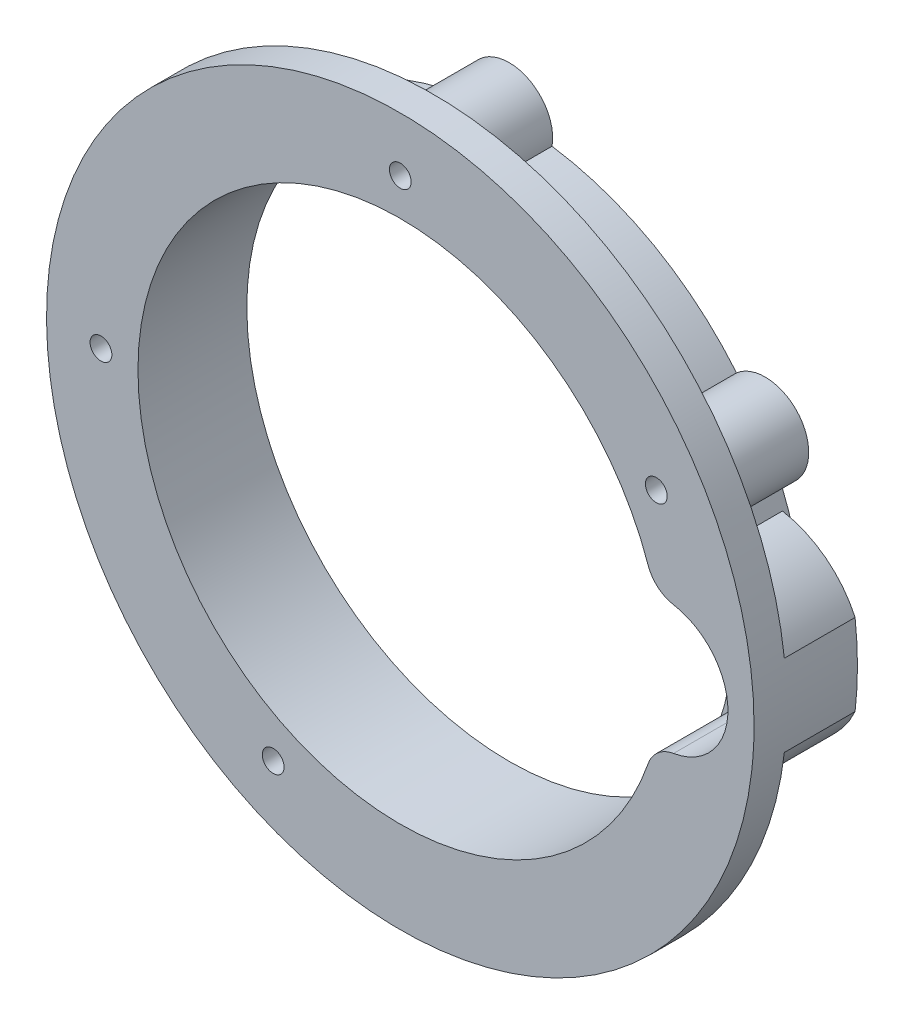
ISO-10303-21;
HEADER;
FILE_DESCRIPTION(('STEP AP214'),'2;1');
FILE_NAME('part.step','',(''),(''),'','','');
FILE_SCHEMA(('AUTOMOTIVE_DESIGN { 1 0 10303 214 1 1 1 1 }'));
ENDSEC;
DATA;
#1=APPLICATION_CONTEXT('core data for automotive mechanical design processes');
#2=APPLICATION_PROTOCOL_DEFINITION('international standard','automotive_design',2000,#1);
#3=PRODUCT_CONTEXT('',#1,'mechanical');
#4=PRODUCT('Part','Part','',(#3));
#5=PRODUCT_RELATED_PRODUCT_CATEGORY('part','',(#4));
#6=PRODUCT_DEFINITION_FORMATION('','',#4);
#7=PRODUCT_DEFINITION_CONTEXT('part definition',#1,'design');
#8=PRODUCT_DEFINITION('design','',#6,#7);
#9=PRODUCT_DEFINITION_SHAPE('','',#8);
#10=(LENGTH_UNIT() NAMED_UNIT(*) SI_UNIT(.MILLI.,.METRE.));
#11=(NAMED_UNIT(*) PLANE_ANGLE_UNIT() SI_UNIT($,.RADIAN.));
#12=(NAMED_UNIT(*) SI_UNIT($,.STERADIAN.) SOLID_ANGLE_UNIT());
#13=UNCERTAINTY_MEASURE_WITH_UNIT(LENGTH_MEASURE(1.E-05),#10,'distance_accuracy_value','');
#14=(GEOMETRIC_REPRESENTATION_CONTEXT(3) GLOBAL_UNCERTAINTY_ASSIGNED_CONTEXT((#13)) GLOBAL_UNIT_ASSIGNED_CONTEXT((#10,
#11,#12)) REPRESENTATION_CONTEXT('',''));
#15=CARTESIAN_POINT('',(0.,0.,0.));
#16=DIRECTION('',(0.,0.,1.));
#17=DIRECTION('',(1.,0.,0.));
#18=AXIS2_PLACEMENT_3D('',#15,#16,#17);
#19=CARTESIAN_POINT('',(0.,0.,0.));
#20=DIRECTION('',(0.,0.,1.));
#21=DIRECTION('',(1.,0.,0.));
#22=AXIS2_PLACEMENT_3D('',#19,#20,#21);
#23=PLANE('',#22);
#24=CARTESIAN_POINT('',(-11.6772727272727,-24.8976163849653,0.));
#25=DIRECTION('',(0.,0.,1.));
#26=DIRECTION('',(1.,0.,0.));
#27=AXIS2_PLACEMENT_3D('',#24,#25,#26);
#28=CIRCLE('',#27,1.);
#29=CARTESIAN_POINT('',(-10.6772727272727,-24.8976163849653,0.));
#30=VERTEX_POINT('',#29);
#31=EDGE_CURVE('E260',#30,#30,#28,.T.);
#32=ORIENTED_EDGE('',*,*,#31,.T.);
#33=EDGE_LOOP('',(#32));
#34=FACE_BOUND('',#33,.T.);
#35=CARTESIAN_POINT('',(-27.5,0.,0.));
#36=DIRECTION('',(0.,0.,1.));
#37=DIRECTION('',(1.,0.,0.));
#38=AXIS2_PLACEMENT_3D('',#35,#36,#37);
#39=CIRCLE('',#38,1.);
#40=CARTESIAN_POINT('',(-26.5,0.,0.));
#41=VERTEX_POINT('',#40);
#42=EDGE_CURVE('E268',#41,#41,#39,.T.);
#43=ORIENTED_EDGE('',*,*,#42,.T.);
#44=EDGE_LOOP('',(#43));
#45=FACE_BOUND('',#44,.T.);
#46=CARTESIAN_POINT('',(23.5226916995778,14.2454545454545,0.));
#47=DIRECTION('',(0.,0.,1.));
#48=DIRECTION('',(1.,0.,0.));
#49=AXIS2_PLACEMENT_3D('',#46,#47,#48);
#50=CIRCLE('',#49,1.);
#51=CARTESIAN_POINT('',(24.5226916995778,14.2454545454545,0.));
#52=VERTEX_POINT('',#51);
#53=EDGE_CURVE('E276',#52,#52,#50,.T.);
#54=ORIENTED_EDGE('',*,*,#53,.T.);
#55=EDGE_LOOP('',(#54));
#56=FACE_BOUND('',#55,.T.);
#57=CARTESIAN_POINT('',(0.,27.5,0.));
#58=DIRECTION('',(0.,0.,1.));
#59=DIRECTION('',(1.,0.,0.));
#60=AXIS2_PLACEMENT_3D('',#57,#58,#59);
#61=CIRCLE('',#60,1.);
#62=CARTESIAN_POINT('',(1.,27.5,0.));
#63=VERTEX_POINT('',#62);
#64=EDGE_CURVE('E284',#63,#63,#61,.T.);
#65=ORIENTED_EDGE('',*,*,#64,.T.);
#66=EDGE_LOOP('',(#65));
#67=FACE_BOUND('',#66,.T.);
#68=CARTESIAN_POINT('',(0.,0.,0.));
#69=DIRECTION('',(0.,0.,1.));
#70=DIRECTION('',(1.,0.,0.));
#71=AXIS2_PLACEMENT_3D('',#68,#69,#70);
#72=CIRCLE('',#71,24.1);
#73=CARTESIAN_POINT('',(24.1,0.,0.));
#74=VERTEX_POINT('',#73);
#75=EDGE_CURVE('E292',#74,#74,#72,.T.);
#76=ORIENTED_EDGE('',*,*,#75,.T.);
#77=EDGE_LOOP('',(#76));
#78=FACE_BOUND('',#77,.T.);
#79=CARTESIAN_POINT('',(0.,0.,0.));
#80=DIRECTION('',(0.,0.,1.));
#81=DIRECTION('',(1.,0.,0.));
#82=AXIS2_PLACEMENT_3D('',#79,#80,#81);
#83=CIRCLE('',#82,27.1);
#84=CARTESIAN_POINT('',(-26.812,-3.94038779817419,0.));
#85=VERTEX_POINT('',#84);
#86=CARTESIAN_POINT('',(-14.9526290971118,-22.6015239106615,0.));
#87=VERTEX_POINT('',#86);
#88=EDGE_CURVE('E201',#85,#87,#83,.T.);
#89=ORIENTED_EDGE('',*,*,#88,.F.);
#90=CARTESIAN_POINT('',(-27.5,0.,0.));
#91=DIRECTION('',(0.,0.,1.));
#92=DIRECTION('',(1.,0.,0.));
#93=AXIS2_PLACEMENT_3D('',#90,#91,#92);
#94=CIRCLE('',#93,4.);
#95=CARTESIAN_POINT('',(-26.812,3.94038779817419,0.));
#96=VERTEX_POINT('',#95);
#97=EDGE_CURVE('E214',#96,#85,#94,.T.);
#98=ORIENTED_EDGE('',*,*,#97,.F.);
#99=CARTESIAN_POINT('',(-3.94038779817418,26.812,0.));
#100=VERTEX_POINT('',#99);
#101=EDGE_CURVE('E55',#100,#96,#83,.T.);
#102=ORIENTED_EDGE('',*,*,#101,.F.);
#103=CARTESIAN_POINT('',(0.,27.5,0.));
#104=DIRECTION('',(0.,0.,1.));
#105=DIRECTION('',(1.,0.,0.));
#106=AXIS2_PLACEMENT_3D('',#103,#104,#105);
#107=CIRCLE('',#106,4.);
#108=CARTESIAN_POINT('',(3.94038779817418,26.812,0.));
#109=VERTEX_POINT('',#108);
#110=EDGE_CURVE('E203',#109,#100,#107,.T.);
#111=ORIENTED_EDGE('',*,*,#110,.F.);
#112=CARTESIAN_POINT('',(20.8930107119537,17.2595510773075,0.));
#113=VERTEX_POINT('',#112);
#114=EDGE_CURVE('E202',#113,#109,#83,.T.);
#115=ORIENTED_EDGE('',*,*,#114,.F.);
#116=CARTESIAN_POINT('',(23.5226916995778,14.2454545454545,0.));
#117=DIRECTION('',(0.,0.,1.));
#118=DIRECTION('',(1.,0.,0.));
#119=AXIS2_PLACEMENT_3D('',#116,#117,#118);
#120=CIRCLE('',#119,4.);
#121=CARTESIAN_POINT('',(24.9753827316158,10.5185672697999,0.));
#122=VERTEX_POINT('',#121);
#123=EDGE_CURVE('E209',#122,#113,#120,.T.);
#124=ORIENTED_EDGE('',*,*,#123,.F.);
#125=CARTESIAN_POINT('',(-7.81762809297082,-25.9479226721523,0.));
#126=VERTEX_POINT('',#125);
#127=EDGE_CURVE('E198',#126,#122,#83,.T.);
#128=ORIENTED_EDGE('',*,*,#127,.F.);
#129=CARTESIAN_POINT('',(-11.6772727272727,-24.8976163849653,0.));
#130=DIRECTION('',(0.,0.,1.));
#131=DIRECTION('',(1.,0.,0.));
#132=AXIS2_PLACEMENT_3D('',#129,#130,#131);
#133=CIRCLE('',#132,4.);
#134=EDGE_CURVE('E194',#87,#126,#133,.T.);
#135=ORIENTED_EDGE('',*,*,#134,.F.);
#136=EDGE_LOOP('',(#89,#98,#102,#111,#115,#124,#128,#135));
#137=FACE_BOUND('',#136,.T.);
#138=ADVANCED_FACE('F39',(#34,#45,#56,#67,#78,#137),#23,.F.);
#139=CARTESIAN_POINT('',(0.,0.,10.));
#140=DIRECTION('',(0.,0.,1.));
#141=DIRECTION('',(1.,0.,0.));
#142=AXIS2_PLACEMENT_3D('',#139,#140,#141);
#143=PLANE('',#142);
#144=CARTESIAN_POINT('',(24.1,0.,10.));
#145=DIRECTION('',(0.,0.,1.));
#146=DIRECTION('',(1.,0.,0.));
#147=AXIS2_PLACEMENT_3D('',#144,#145,#146);
#148=CIRCLE('',#147,6.);
#149=CARTESIAN_POINT('',(25.1041493775934,-5.91537691339097,10.));
#150=VERTEX_POINT('',#149);
#151=CARTESIAN_POINT('',(25.1041493775934,5.91537691339097,10.));
#152=VERTEX_POINT('',#151);
#153=EDGE_CURVE('E255',#150,#152,#148,.T.);
#154=ORIENTED_EDGE('',*,*,#153,.F.);
#155=CARTESIAN_POINT('',(25.60622406639,-8.87306537008645,10.));
#156=DIRECTION('',(0.,0.,1.));
#157=DIRECTION('',(1.,0.,0.));
#158=AXIS2_PLACEMENT_3D('',#155,#156,#157);
#159=CIRCLE('',#158,3.);
#160=CARTESIAN_POINT('',(22.7715867158672,-7.8908072110363,10.));
#161=VERTEX_POINT('',#160);
#162=EDGE_CURVE('E321',#150,#161,#159,.T.);
#163=ORIENTED_EDGE('',*,*,#162,.T.);
#164=CARTESIAN_POINT('',(0.,0.,10.));
#165=DIRECTION('',(0.,0.,1.));
#166=DIRECTION('',(1.,0.,0.));
#167=AXIS2_PLACEMENT_3D('',#164,#165,#166);
#168=CIRCLE('',#167,24.1);
#169=CARTESIAN_POINT('',(22.7715867158672,7.8908072110363,10.));
#170=VERTEX_POINT('',#169);
#171=EDGE_CURVE('E296',#170,#161,#168,.T.);
#172=ORIENTED_EDGE('',*,*,#171,.F.);
#173=CARTESIAN_POINT('',(25.60622406639,8.87306537008645,10.));
#174=DIRECTION('',(0.,0.,1.));
#175=DIRECTION('',(1.,0.,0.));
#176=AXIS2_PLACEMENT_3D('',#173,#174,#175);
#177=CIRCLE('',#176,3.);
#178=EDGE_CURVE('E318',#170,#152,#177,.T.);
#179=ORIENTED_EDGE('',*,*,#178,.T.);
#180=EDGE_LOOP('',(#154,#163,#172,#179));
#181=FACE_BOUND('',#180,.T.);
#182=CARTESIAN_POINT('',(-27.5,0.,10.));
#183=DIRECTION('',(0.,0.,1.));
#184=DIRECTION('',(1.,0.,0.));
#185=AXIS2_PLACEMENT_3D('',#182,#183,#184);
#186=CIRCLE('',#185,1.);
#187=CARTESIAN_POINT('',(-26.5,0.,10.));
#188=VERTEX_POINT('',#187);
#189=EDGE_CURVE('E272',#188,#188,#186,.T.);
#190=ORIENTED_EDGE('',*,*,#189,.F.);
#191=EDGE_LOOP('',(#190));
#192=FACE_BOUND('',#191,.T.);
#193=CARTESIAN_POINT('',(0.,27.5,10.));
#194=DIRECTION('',(0.,0.,1.));
#195=DIRECTION('',(1.,0.,0.));
#196=AXIS2_PLACEMENT_3D('',#193,#194,#195);
#197=CIRCLE('',#196,1.);
#198=CARTESIAN_POINT('',(1.,27.5,10.));
#199=VERTEX_POINT('',#198);
#200=EDGE_CURVE('E288',#199,#199,#197,.T.);
#201=ORIENTED_EDGE('',*,*,#200,.F.);
#202=EDGE_LOOP('',(#201));
#203=FACE_BOUND('',#202,.T.);
#204=CARTESIAN_POINT('',(0.,0.,10.));
#205=DIRECTION('',(0.,0.,1.));
#206=DIRECTION('',(1.,0.,0.));
#207=AXIS2_PLACEMENT_3D('',#204,#205,#206);
#208=CIRCLE('',#207,32.5);
#209=CARTESIAN_POINT('',(32.5,0.,10.));
#210=VERTEX_POINT('',#209);
#211=EDGE_CURVE('E300',#210,#210,#208,.T.);
#212=ORIENTED_EDGE('',*,*,#211,.T.);
#213=EDGE_LOOP('',(#212));
#214=FACE_BOUND('',#213,.T.);
#215=CARTESIAN_POINT('',(23.5226916995778,14.2454545454545,10.));
#216=DIRECTION('',(0.,0.,1.));
#217=DIRECTION('',(1.,0.,0.));
#218=AXIS2_PLACEMENT_3D('',#215,#216,#217);
#219=CIRCLE('',#218,1.);
#220=CARTESIAN_POINT('',(24.5226916995778,14.2454545454545,10.));
#221=VERTEX_POINT('',#220);
#222=EDGE_CURVE('E280',#221,#221,#219,.T.);
#223=ORIENTED_EDGE('',*,*,#222,.F.);
#224=EDGE_LOOP('',(#223));
#225=FACE_BOUND('',#224,.T.);
#226=CARTESIAN_POINT('',(-11.6772727272727,-24.8976163849653,10.));
#227=DIRECTION('',(0.,0.,1.));
#228=DIRECTION('',(1.,0.,0.));
#229=AXIS2_PLACEMENT_3D('',#226,#227,#228);
#230=CIRCLE('',#229,1.);
#231=CARTESIAN_POINT('',(-10.6772727272727,-24.8976163849653,10.));
#232=VERTEX_POINT('',#231);
#233=EDGE_CURVE('E264',#232,#232,#230,.T.);
#234=ORIENTED_EDGE('',*,*,#233,.F.);
#235=EDGE_LOOP('',(#234));
#236=FACE_BOUND('',#235,.T.);
#237=ADVANCED_FACE('F345',(#181,#192,#203,#214,#225,#236),#143,.T.);
#238=CARTESIAN_POINT('',(0.,0.,10.));
#239=DIRECTION('',(0.,0.,-1.));
#240=DIRECTION('',(-1.,0.,0.));
#241=AXIS2_PLACEMENT_3D('',#238,#239,#240);
#242=CYLINDRICAL_SURFACE('',#241,32.5);
#243=DIRECTION('',(0.,0.,1.));
#244=VECTOR('',#243,1.);
#245=CARTESIAN_POINT('',(32.2834024896266,-3.74592094053971,10.));
#246=LINE('',#245,#244);
#247=CARTESIAN_POINT('',(32.2834024896266,-3.7459209405397,7.));
#248=VERTEX_POINT('',#247);
#249=CARTESIAN_POINT('',(32.2834024896266,-3.74592094053971,0.5));
#250=VERTEX_POINT('',#249);
#251=EDGE_CURVE('E247',#248,#250,#246,.F.);
#252=ORIENTED_EDGE('',*,*,#251,.T.);
#253=CARTESIAN_POINT('',(0.,0.,0.5));
#254=DIRECTION('',(0.,0.,1.));
#255=DIRECTION('',(1.,0.,0.));
#256=AXIS2_PLACEMENT_3D('',#253,#254,#255);
#257=CIRCLE('',#256,32.5);
#258=CARTESIAN_POINT('',(32.2834024896266,3.7459209405397,0.5));
#259=VERTEX_POINT('',#258);
#260=EDGE_CURVE('E251',#250,#259,#257,.T.);
#261=ORIENTED_EDGE('',*,*,#260,.T.);
#262=DIRECTION('',(0.,0.,1.));
#263=VECTOR('',#262,1.);
#264=CARTESIAN_POINT('',(32.2834024896266,3.7459209405397,3.5));
#265=LINE('',#264,#263);
#266=CARTESIAN_POINT('',(32.2834024896266,3.7459209405397,7.));
#267=VERTEX_POINT('',#266);
#268=EDGE_CURVE('E244',#267,#259,#265,.F.);
#269=ORIENTED_EDGE('',*,*,#268,.F.);
#270=CARTESIAN_POINT('',(0.,0.,7.));
#271=DIRECTION('',(0.,0.,1.));
#272=DIRECTION('',(1.,0.,0.));
#273=AXIS2_PLACEMENT_3D('',#270,#271,#272);
#274=CIRCLE('',#273,32.5);
#275=EDGE_CURVE('E170',#267,#248,#274,.T.);
#276=ORIENTED_EDGE('',*,*,#275,.T.);
#277=EDGE_LOOP('',(#252,#261,#269,#276));
#278=FACE_BOUND('',#277,.T.);
#279=ORIENTED_EDGE('',*,*,#211,.F.);
#280=EDGE_LOOP('',(#279));
#281=FACE_BOUND('',#280,.T.);
#282=ADVANCED_FACE('F368',(#278,#281),#242,.T.);
#283=CARTESIAN_POINT('',(0.,0.,10.));
#284=DIRECTION('',(0.,0.,-1.));
#285=DIRECTION('',(-1.,0.,0.));
#286=AXIS2_PLACEMENT_3D('',#283,#284,#285);
#287=CYLINDRICAL_SURFACE('',#286,24.1);
#288=ORIENTED_EDGE('',*,*,#171,.T.);
#289=DIRECTION('',(0.,0.,-1.));
#290=VECTOR('',#289,1.);
#291=CARTESIAN_POINT('',(22.7715867158672,-7.89080721103629,10.));
#292=LINE('',#291,#290);
#293=CARTESIAN_POINT('',(22.7715867158672,-7.8908072110363,3.5));
#294=VERTEX_POINT('',#293);
#295=EDGE_CURVE('E327',#161,#294,#292,.T.);
#296=ORIENTED_EDGE('',*,*,#295,.T.);
#297=CARTESIAN_POINT('',(0.,0.,3.5));
#298=DIRECTION('',(0.,0.,1.));
#299=DIRECTION('',(1.,0.,0.));
#300=AXIS2_PLACEMENT_3D('',#297,#298,#299);
#301=CIRCLE('',#300,24.1);
#302=CARTESIAN_POINT('',(22.7715867158672,7.8908072110363,3.5));
#303=VERTEX_POINT('',#302);
#304=EDGE_CURVE('E307',#294,#303,#301,.T.);
#305=ORIENTED_EDGE('',*,*,#304,.T.);
#306=DIRECTION('',(0.,0.,-1.));
#307=VECTOR('',#306,1.);
#308=CARTESIAN_POINT('',(22.7715867158672,7.89080721103629,10.));
#309=LINE('',#308,#307);
#310=EDGE_CURVE('E324',#303,#170,#309,.F.);
#311=ORIENTED_EDGE('',*,*,#310,.T.);
#312=EDGE_LOOP('',(#288,#296,#305,#311));
#313=FACE_BOUND('',#312,.T.);
#314=ORIENTED_EDGE('',*,*,#75,.F.);
#315=EDGE_LOOP('',(#314));
#316=FACE_BOUND('',#315,.T.);
#317=ADVANCED_FACE('F349',(#313,#316),#287,.F.);
#318=CARTESIAN_POINT('',(0.,27.5,10.));
#319=DIRECTION('',(0.,0.,-1.));
#320=DIRECTION('',(-1.,0.,0.));
#321=AXIS2_PLACEMENT_3D('',#318,#319,#320);
#322=CYLINDRICAL_SURFACE('',#321,1.);
#323=ORIENTED_EDGE('',*,*,#200,.T.);
#324=EDGE_LOOP('',(#323));
#325=FACE_BOUND('',#324,.T.);
#326=ORIENTED_EDGE('',*,*,#64,.F.);
#327=EDGE_LOOP('',(#326));
#328=FACE_BOUND('',#327,.T.);
#329=ADVANCED_FACE('F378',(#325,#328),#322,.F.);
#330=CARTESIAN_POINT('',(23.5226916995778,14.2454545454545,10.));
#331=DIRECTION('',(0.,0.,-1.));
#332=DIRECTION('',(-1.,0.,0.));
#333=AXIS2_PLACEMENT_3D('',#330,#331,#332);
#334=CYLINDRICAL_SURFACE('',#333,1.);
#335=ORIENTED_EDGE('',*,*,#222,.T.);
#336=EDGE_LOOP('',(#335));
#337=FACE_BOUND('',#336,.T.);
#338=ORIENTED_EDGE('',*,*,#53,.F.);
#339=EDGE_LOOP('',(#338));
#340=FACE_BOUND('',#339,.T.);
#341=ADVANCED_FACE('F398',(#337,#340),#334,.F.);
#342=CARTESIAN_POINT('',(-27.5,0.,10.));
#343=DIRECTION('',(0.,0.,-1.));
#344=DIRECTION('',(-1.,0.,0.));
#345=AXIS2_PLACEMENT_3D('',#342,#343,#344);
#346=CYLINDRICAL_SURFACE('',#345,1.);
#347=ORIENTED_EDGE('',*,*,#189,.T.);
#348=EDGE_LOOP('',(#347));
#349=FACE_BOUND('',#348,.T.);
#350=ORIENTED_EDGE('',*,*,#42,.F.);
#351=EDGE_LOOP('',(#350));
#352=FACE_BOUND('',#351,.T.);
#353=ADVANCED_FACE('F390',(#349,#352),#346,.F.);
#354=CARTESIAN_POINT('',(-11.6772727272727,-24.8976163849653,10.));
#355=DIRECTION('',(0.,0.,-1.));
#356=DIRECTION('',(-1.,0.,0.));
#357=AXIS2_PLACEMENT_3D('',#354,#355,#356);
#358=CYLINDRICAL_SURFACE('',#357,1.);
#359=ORIENTED_EDGE('',*,*,#233,.T.);
#360=EDGE_LOOP('',(#359));
#361=FACE_BOUND('',#360,.T.);
#362=ORIENTED_EDGE('',*,*,#31,.F.);
#363=EDGE_LOOP('',(#362));
#364=FACE_BOUND('',#363,.T.);
#365=ADVANCED_FACE('F387',(#361,#364),#358,.F.);
#366=CARTESIAN_POINT('',(24.1,0.,3.5));
#367=DIRECTION('',(0.,0.,1.));
#368=DIRECTION('',(1.,0.,0.));
#369=AXIS2_PLACEMENT_3D('',#366,#367,#368);
#370=CYLINDRICAL_SURFACE('',#369,6.);
#371=CARTESIAN_POINT('',(24.1,0.,3.5));
#372=DIRECTION('',(0.,0.,1.));
#373=DIRECTION('',(1.,0.,0.));
#374=AXIS2_PLACEMENT_3D('',#371,#372,#373);
#375=CIRCLE('',#374,6.);
#376=CARTESIAN_POINT('',(25.1041493775934,-5.91537691339097,3.5));
#377=VERTEX_POINT('',#376);
#378=CARTESIAN_POINT('',(25.1041493775934,5.91537691339097,3.5));
#379=VERTEX_POINT('',#378);
#380=EDGE_CURVE('E256',#377,#379,#375,.T.);
#381=ORIENTED_EDGE('',*,*,#380,.F.);
#382=DIRECTION('',(0.,0.,1.));
#383=VECTOR('',#382,1.);
#384=CARTESIAN_POINT('',(25.1041493775934,-5.91537691339097,3.5));
#385=LINE('',#384,#383);
#386=EDGE_CURVE('E314',#377,#150,#385,.T.);
#387=ORIENTED_EDGE('',*,*,#386,.T.);
#388=ORIENTED_EDGE('',*,*,#153,.T.);
#389=DIRECTION('',(0.,0.,1.));
#390=VECTOR('',#389,1.);
#391=CARTESIAN_POINT('',(25.1041493775934,5.91537691339097,3.5));
#392=LINE('',#391,#390);
#393=EDGE_CURVE('E310',#152,#379,#392,.F.);
#394=ORIENTED_EDGE('',*,*,#393,.T.);
#395=EDGE_LOOP('',(#381,#387,#388,#394));
#396=FACE_BOUND('',#395,.T.);
#397=ADVANCED_FACE('F339',(#396),#370,.F.);
#398=CARTESIAN_POINT('',(24.1,0.,3.5));
#399=DIRECTION('',(0.,0.,1.));
#400=DIRECTION('',(1.,0.,0.));
#401=AXIS2_PLACEMENT_3D('',#398,#399,#400);
#402=PLANE('',#401);
#403=ORIENTED_EDGE('',*,*,#304,.F.);
#404=CARTESIAN_POINT('',(25.60622406639,-8.87306537008645,3.5));
#405=DIRECTION('',(0.,0.,1.));
#406=DIRECTION('',(1.,0.,0.));
#407=AXIS2_PLACEMENT_3D('',#404,#405,#406);
#408=CIRCLE('',#407,3.);
#409=EDGE_CURVE('E48',#294,#377,#408,.F.);
#410=ORIENTED_EDGE('',*,*,#409,.T.);
#411=ORIENTED_EDGE('',*,*,#380,.T.);
#412=CARTESIAN_POINT('',(25.60622406639,8.87306537008645,3.5));
#413=DIRECTION('',(0.,0.,1.));
#414=DIRECTION('',(1.,0.,0.));
#415=AXIS2_PLACEMENT_3D('',#412,#413,#414);
#416=CIRCLE('',#415,3.);
#417=EDGE_CURVE('E11',#379,#303,#416,.F.);
#418=ORIENTED_EDGE('',*,*,#417,.T.);
#419=EDGE_LOOP('',(#403,#410,#411,#418));
#420=FACE_BOUND('',#419,.T.);
#421=ADVANCED_FACE('F334',(#420),#402,.T.);
#422=CARTESIAN_POINT('',(25.60622406639,-8.87306537008645,10.));
#423=DIRECTION('',(0.,0.,1.));
#424=DIRECTION('',(1.,0.,0.));
#425=AXIS2_PLACEMENT_3D('',#422,#423,#424);
#426=CYLINDRICAL_SURFACE('',#425,3.);
#427=ORIENTED_EDGE('',*,*,#409,.F.);
#428=ORIENTED_EDGE('',*,*,#295,.F.);
#429=ORIENTED_EDGE('',*,*,#162,.F.);
#430=ORIENTED_EDGE('',*,*,#386,.F.);
#431=EDGE_LOOP('',(#427,#428,#429,#430));
#432=FACE_BOUND('',#431,.T.);
#433=ADVANCED_FACE('F342',(#432),#426,.T.);
#434=CARTESIAN_POINT('',(25.60622406639,8.87306537008645,10.));
#435=DIRECTION('',(0.,0.,-1.));
#436=DIRECTION('',(-1.,0.,0.));
#437=AXIS2_PLACEMENT_3D('',#434,#435,#436);
#438=CYLINDRICAL_SURFACE('',#437,3.);
#439=ORIENTED_EDGE('',*,*,#178,.F.);
#440=ORIENTED_EDGE('',*,*,#310,.F.);
#441=ORIENTED_EDGE('',*,*,#417,.F.);
#442=ORIENTED_EDGE('',*,*,#393,.F.);
#443=EDGE_LOOP('',(#439,#440,#441,#442));
#444=FACE_BOUND('',#443,.T.);
#445=ADVANCED_FACE('F41',(#444),#438,.T.);
#446=CARTESIAN_POINT('',(24.1,0.,3.5));
#447=DIRECTION('',(0.,0.,1.));
#448=DIRECTION('',(1.,0.,0.));
#449=AXIS2_PLACEMENT_3D('',#446,#447,#448);
#450=CYLINDRICAL_SURFACE('',#449,9.);
#451=CARTESIAN_POINT('',(24.1,0.,7.));
#452=DIRECTION('',(0.,0.,1.));
#453=DIRECTION('',(1.,0.,0.));
#454=AXIS2_PLACEMENT_3D('',#451,#452,#453);
#455=CIRCLE('',#454,9.);
#456=CARTESIAN_POINT('',(25.60622406639,-8.87306537008646,7.));
#457=VERTEX_POINT('',#456);
#458=EDGE_CURVE('E174',#457,#248,#455,.T.);
#459=ORIENTED_EDGE('',*,*,#458,.F.);
#460=DIRECTION('',(0.,0.,-1.));
#461=VECTOR('',#460,1.);
#462=CARTESIAN_POINT('',(25.60622406639,-8.87306537008646,7.));
#463=LINE('',#462,#461);
#464=CARTESIAN_POINT('',(25.60622406639,-8.87306537008646,0.5));
#465=VERTEX_POINT('',#464);
#466=EDGE_CURVE('E180',#457,#465,#463,.T.);
#467=ORIENTED_EDGE('',*,*,#466,.T.);
#468=CARTESIAN_POINT('',(24.1,0.,0.5));
#469=DIRECTION('',(0.,0.,1.));
#470=DIRECTION('',(1.,0.,0.));
#471=AXIS2_PLACEMENT_3D('',#468,#469,#470);
#472=CIRCLE('',#471,9.);
#473=EDGE_CURVE('E190',#465,#250,#472,.T.);
#474=ORIENTED_EDGE('',*,*,#473,.T.);
#475=ORIENTED_EDGE('',*,*,#251,.F.);
#476=EDGE_LOOP('',(#459,#467,#474,#475));
#477=FACE_BOUND('',#476,.T.);
#478=ADVANCED_FACE('F354',(#477),#450,.T.);
#479=CARTESIAN_POINT('',(0.,0.,10.));
#480=DIRECTION('',(0.,0.,-1.));
#481=DIRECTION('',(-1.,0.,0.));
#482=AXIS2_PLACEMENT_3D('',#479,#480,#481);
#483=CYLINDRICAL_SURFACE('',#482,27.1);
#484=DIRECTION('',(0.,0.,1.));
#485=VECTOR('',#484,1.);
#486=CARTESIAN_POINT('',(3.94038779817419,26.812,10.));
#487=LINE('',#486,#485);
#488=CARTESIAN_POINT('',(3.94038779817419,26.812,7.));
#489=VERTEX_POINT('',#488);
#490=EDGE_CURVE('E241',#109,#489,#487,.T.);
#491=ORIENTED_EDGE('',*,*,#490,.T.);
#492=CARTESIAN_POINT('',(0.,0.,7.));
#493=DIRECTION('',(0.,0.,1.));
#494=DIRECTION('',(1.,0.,0.));
#495=AXIS2_PLACEMENT_3D('',#492,#493,#494);
#496=CIRCLE('',#495,27.1);
#497=CARTESIAN_POINT('',(20.8930107119537,17.2595510773075,7.));
#498=VERTEX_POINT('',#497);
#499=EDGE_CURVE('E164',#498,#489,#496,.T.);
#500=ORIENTED_EDGE('',*,*,#499,.F.);
#501=DIRECTION('',(0.,0.,1.));
#502=VECTOR('',#501,1.);
#503=CARTESIAN_POINT('',(20.8930107119537,17.2595510773075,10.));
#504=LINE('',#503,#502);
#505=EDGE_CURVE('E235',#113,#498,#504,.T.);
#506=ORIENTED_EDGE('',*,*,#505,.F.);
#507=ORIENTED_EDGE('',*,*,#114,.T.);
#508=EDGE_LOOP('',(#491,#500,#506,#507));
#509=FACE_BOUND('',#508,.T.);
#510=ADVANCED_FACE('F359',(#509),#483,.T.);
#511=ORIENTED_EDGE('',*,*,#101,.T.);
#512=DIRECTION('',(0.,0.,1.));
#513=VECTOR('',#512,1.);
#514=CARTESIAN_POINT('',(-26.812,3.94038779817419,10.));
#515=LINE('',#514,#513);
#516=CARTESIAN_POINT('',(-26.812,3.94038779817418,7.));
#517=VERTEX_POINT('',#516);
#518=EDGE_CURVE('E227',#96,#517,#515,.T.);
#519=ORIENTED_EDGE('',*,*,#518,.T.);
#520=CARTESIAN_POINT('',(-3.94038779817419,26.812,7.));
#521=VERTEX_POINT('',#520);
#522=EDGE_CURVE('E452',#521,#517,#496,.T.);
#523=ORIENTED_EDGE('',*,*,#522,.F.);
#524=DIRECTION('',(0.,0.,1.));
#525=VECTOR('',#524,1.);
#526=CARTESIAN_POINT('',(-3.94038779817418,26.812,10.));
#527=LINE('',#526,#525);
#528=EDGE_CURVE('E238',#100,#521,#527,.T.);
#529=ORIENTED_EDGE('',*,*,#528,.F.);
#530=EDGE_LOOP('',(#511,#519,#523,#529));
#531=FACE_BOUND('',#530,.T.);
#532=ADVANCED_FACE('F459',(#531),#483,.T.);
#533=ORIENTED_EDGE('',*,*,#88,.T.);
#534=DIRECTION('',(0.,0.,1.));
#535=VECTOR('',#534,1.);
#536=CARTESIAN_POINT('',(-14.9526290971118,-22.6015239106615,10.));
#537=LINE('',#536,#535);
#538=CARTESIAN_POINT('',(-14.9526290971118,-22.6015239106615,7.));
#539=VERTEX_POINT('',#538);
#540=EDGE_CURVE('E186',#87,#539,#537,.T.);
#541=ORIENTED_EDGE('',*,*,#540,.T.);
#542=CARTESIAN_POINT('',(-26.812,-3.94038779817418,7.));
#543=VERTEX_POINT('',#542);
#544=EDGE_CURVE('E166',#543,#539,#496,.T.);
#545=ORIENTED_EDGE('',*,*,#544,.F.);
#546=DIRECTION('',(0.,0.,1.));
#547=VECTOR('',#546,1.);
#548=CARTESIAN_POINT('',(-26.812,-3.94038779817418,10.));
#549=LINE('',#548,#547);
#550=EDGE_CURVE('E230',#85,#543,#549,.T.);
#551=ORIENTED_EDGE('',*,*,#550,.F.);
#552=EDGE_LOOP('',(#533,#541,#545,#551));
#553=FACE_BOUND('',#552,.T.);
#554=ADVANCED_FACE('F464',(#553),#483,.T.);
#555=CARTESIAN_POINT('',(0.,0.,7.));
#556=DIRECTION('',(0.,0.,1.));
#557=DIRECTION('',(1.,0.,0.));
#558=AXIS2_PLACEMENT_3D('',#555,#556,#557);
#559=PLANE('',#558);
#560=CARTESIAN_POINT('',(25.60622406639,8.87306537008646,7.));
#561=VERTEX_POINT('',#560);
#562=EDGE_CURVE('E63',#267,#561,#455,.T.);
#563=ORIENTED_EDGE('',*,*,#562,.T.);
#564=CARTESIAN_POINT('',(24.9753827316158,10.5185672697999,7.));
#565=VERTEX_POINT('',#564);
#566=EDGE_CURVE('E154',#561,#565,#496,.T.);
#567=ORIENTED_EDGE('',*,*,#566,.T.);
#568=CARTESIAN_POINT('',(23.5226916995778,14.2454545454545,7.));
#569=DIRECTION('',(0.,0.,1.));
#570=DIRECTION('',(1.,0.,0.));
#571=AXIS2_PLACEMENT_3D('',#568,#569,#570);
#572=CIRCLE('',#571,4.);
#573=EDGE_CURVE('E208',#565,#498,#572,.T.);
#574=ORIENTED_EDGE('',*,*,#573,.T.);
#575=ORIENTED_EDGE('',*,*,#499,.T.);
#576=CARTESIAN_POINT('',(0.,27.5,7.));
#577=DIRECTION('',(0.,0.,1.));
#578=DIRECTION('',(1.,0.,0.));
#579=AXIS2_PLACEMENT_3D('',#576,#577,#578);
#580=CIRCLE('',#579,4.);
#581=EDGE_CURVE('E207',#489,#521,#580,.T.);
#582=ORIENTED_EDGE('',*,*,#581,.T.);
#583=ORIENTED_EDGE('',*,*,#522,.T.);
#584=CARTESIAN_POINT('',(-27.5,0.,7.));
#585=DIRECTION('',(0.,0.,1.));
#586=DIRECTION('',(1.,0.,0.));
#587=AXIS2_PLACEMENT_3D('',#584,#585,#586);
#588=CIRCLE('',#587,4.);
#589=EDGE_CURVE('E213',#517,#543,#588,.T.);
#590=ORIENTED_EDGE('',*,*,#589,.T.);
#591=ORIENTED_EDGE('',*,*,#544,.T.);
#592=CARTESIAN_POINT('',(-11.6772727272727,-24.8976163849653,7.));
#593=DIRECTION('',(0.,0.,1.));
#594=DIRECTION('',(1.,0.,0.));
#595=AXIS2_PLACEMENT_3D('',#592,#593,#594);
#596=CIRCLE('',#595,4.);
#597=CARTESIAN_POINT('',(-7.81762809297082,-25.9479226721523,7.));
#598=VERTEX_POINT('',#597);
#599=EDGE_CURVE('E218',#539,#598,#596,.T.);
#600=ORIENTED_EDGE('',*,*,#599,.T.);
#601=EDGE_CURVE('E197',#598,#457,#496,.T.);
#602=ORIENTED_EDGE('',*,*,#601,.T.);
#603=ORIENTED_EDGE('',*,*,#458,.T.);
#604=ORIENTED_EDGE('',*,*,#275,.F.);
#605=EDGE_LOOP('',(#563,#567,#574,#575,#582,#583,#590,#591,#600,#602,#603,#604));
#606=FACE_BOUND('',#605,.T.);
#607=ADVANCED_FACE('F167',(#606),#559,.F.);
#608=DIRECTION('',(0.,0.,1.));
#609=VECTOR('',#608,1.);
#610=CARTESIAN_POINT('',(24.9753827316158,10.5185672697999,10.));
#611=LINE('',#610,#609);
#612=EDGE_CURVE('E159',#122,#565,#611,.T.);
#613=ORIENTED_EDGE('',*,*,#612,.T.);
#614=ORIENTED_EDGE('',*,*,#566,.F.);
#615=DIRECTION('',(0.,0.,-1.));
#616=VECTOR('',#615,1.);
#617=CARTESIAN_POINT('',(25.60622406639,8.87306537008646,0.5));
#618=LINE('',#617,#616);
#619=CARTESIAN_POINT('',(25.60622406639,8.87306537008646,0.5));
#620=VERTEX_POINT('',#619);
#621=EDGE_CURVE('E157',#620,#561,#618,.F.);
#622=ORIENTED_EDGE('',*,*,#621,.F.);
#623=CARTESIAN_POINT('',(0.,0.,0.5));
#624=DIRECTION('',(0.,0.,1.));
#625=DIRECTION('',(1.,0.,0.));
#626=AXIS2_PLACEMENT_3D('',#623,#624,#625);
#627=CIRCLE('',#626,27.1);
#628=EDGE_CURVE('E181',#465,#620,#627,.T.);
#629=ORIENTED_EDGE('',*,*,#628,.F.);
#630=ORIENTED_EDGE('',*,*,#466,.F.);
#631=ORIENTED_EDGE('',*,*,#601,.F.);
#632=DIRECTION('',(0.,0.,1.));
#633=VECTOR('',#632,1.);
#634=CARTESIAN_POINT('',(-7.81762809297082,-25.9479226721523,10.));
#635=LINE('',#634,#633);
#636=EDGE_CURVE('E224',#126,#598,#635,.T.);
#637=ORIENTED_EDGE('',*,*,#636,.F.);
#638=ORIENTED_EDGE('',*,*,#127,.T.);
#639=EDGE_LOOP('',(#613,#614,#622,#629,#630,#631,#637,#638));
#640=FACE_BOUND('',#639,.T.);
#641=ADVANCED_FACE('F155',(#640),#483,.T.);
#642=CARTESIAN_POINT('',(0.,27.5,10.));
#643=DIRECTION('',(0.,0.,-1.));
#644=DIRECTION('',(-1.,0.,0.));
#645=AXIS2_PLACEMENT_3D('',#642,#643,#644);
#646=CYLINDRICAL_SURFACE('',#645,4.);
#647=ORIENTED_EDGE('',*,*,#110,.T.);
#648=ORIENTED_EDGE('',*,*,#528,.T.);
#649=ORIENTED_EDGE('',*,*,#581,.F.);
#650=ORIENTED_EDGE('',*,*,#490,.F.);
#651=EDGE_LOOP('',(#647,#648,#649,#650));
#652=FACE_BOUND('',#651,.T.);
#653=ADVANCED_FACE('F458',(#652),#646,.T.);
#654=CARTESIAN_POINT('',(23.5226916995778,14.2454545454545,10.));
#655=DIRECTION('',(0.,0.,-1.));
#656=DIRECTION('',(-1.,0.,0.));
#657=AXIS2_PLACEMENT_3D('',#654,#655,#656);
#658=CYLINDRICAL_SURFACE('',#657,4.);
#659=ORIENTED_EDGE('',*,*,#505,.T.);
#660=ORIENTED_EDGE('',*,*,#573,.F.);
#661=ORIENTED_EDGE('',*,*,#612,.F.);
#662=ORIENTED_EDGE('',*,*,#123,.T.);
#663=EDGE_LOOP('',(#659,#660,#661,#662));
#664=FACE_BOUND('',#663,.T.);
#665=ADVANCED_FACE('F468',(#664),#658,.T.);
#666=CARTESIAN_POINT('',(-27.5,0.,10.));
#667=DIRECTION('',(0.,0.,-1.));
#668=DIRECTION('',(-1.,0.,0.));
#669=AXIS2_PLACEMENT_3D('',#666,#667,#668);
#670=CYLINDRICAL_SURFACE('',#669,4.);
#671=ORIENTED_EDGE('',*,*,#550,.T.);
#672=ORIENTED_EDGE('',*,*,#589,.F.);
#673=ORIENTED_EDGE('',*,*,#518,.F.);
#674=ORIENTED_EDGE('',*,*,#97,.T.);
#675=EDGE_LOOP('',(#671,#672,#673,#674));
#676=FACE_BOUND('',#675,.T.);
#677=ADVANCED_FACE('F462',(#676),#670,.T.);
#678=CARTESIAN_POINT('',(-11.6772727272727,-24.8976163849653,10.));
#679=DIRECTION('',(0.,0.,-1.));
#680=DIRECTION('',(-1.,0.,0.));
#681=AXIS2_PLACEMENT_3D('',#678,#679,#680);
#682=CYLINDRICAL_SURFACE('',#681,4.);
#683=ORIENTED_EDGE('',*,*,#636,.T.);
#684=ORIENTED_EDGE('',*,*,#599,.F.);
#685=ORIENTED_EDGE('',*,*,#540,.F.);
#686=ORIENTED_EDGE('',*,*,#134,.T.);
#687=EDGE_LOOP('',(#683,#684,#685,#686));
#688=FACE_BOUND('',#687,.T.);
#689=ADVANCED_FACE('F465',(#688),#682,.T.);
#690=ORIENTED_EDGE('',*,*,#268,.T.);
#691=EDGE_CURVE('E173',#259,#620,#472,.T.);
#692=ORIENTED_EDGE('',*,*,#691,.T.);
#693=ORIENTED_EDGE('',*,*,#621,.T.);
#694=ORIENTED_EDGE('',*,*,#562,.F.);
#695=EDGE_LOOP('',(#690,#692,#693,#694));
#696=FACE_BOUND('',#695,.T.);
#697=ADVANCED_FACE('F176',(#696),#450,.T.);
#698=CARTESIAN_POINT('',(24.1,0.,0.5));
#699=DIRECTION('',(0.,0.,1.));
#700=DIRECTION('',(1.,0.,0.));
#701=AXIS2_PLACEMENT_3D('',#698,#699,#700);
#702=PLANE('',#701);
#703=ORIENTED_EDGE('',*,*,#473,.F.);
#704=ORIENTED_EDGE('',*,*,#628,.T.);
#705=ORIENTED_EDGE('',*,*,#691,.F.);
#706=ORIENTED_EDGE('',*,*,#260,.F.);
#707=EDGE_LOOP('',(#703,#704,#705,#706));
#708=FACE_BOUND('',#707,.T.);
#709=ADVANCED_FACE('F535',(#708),#702,.F.);
#710=CLOSED_SHELL('',(#138,#237,#282,#317,#329,#341,#353,#365,#397,#421,#433,#445,#478,#510,
#532,#554,#607,#641,#653,#665,#677,#689,#697,#709));
#711=MANIFOLD_SOLID_BREP('B2',#710);
#712=ADVANCED_BREP_SHAPE_REPRESENTATION('',(#18,#711),#14);
#713=SHAPE_DEFINITION_REPRESENTATION(#9,#712);
ENDSEC;
END-ISO-10303-21;
